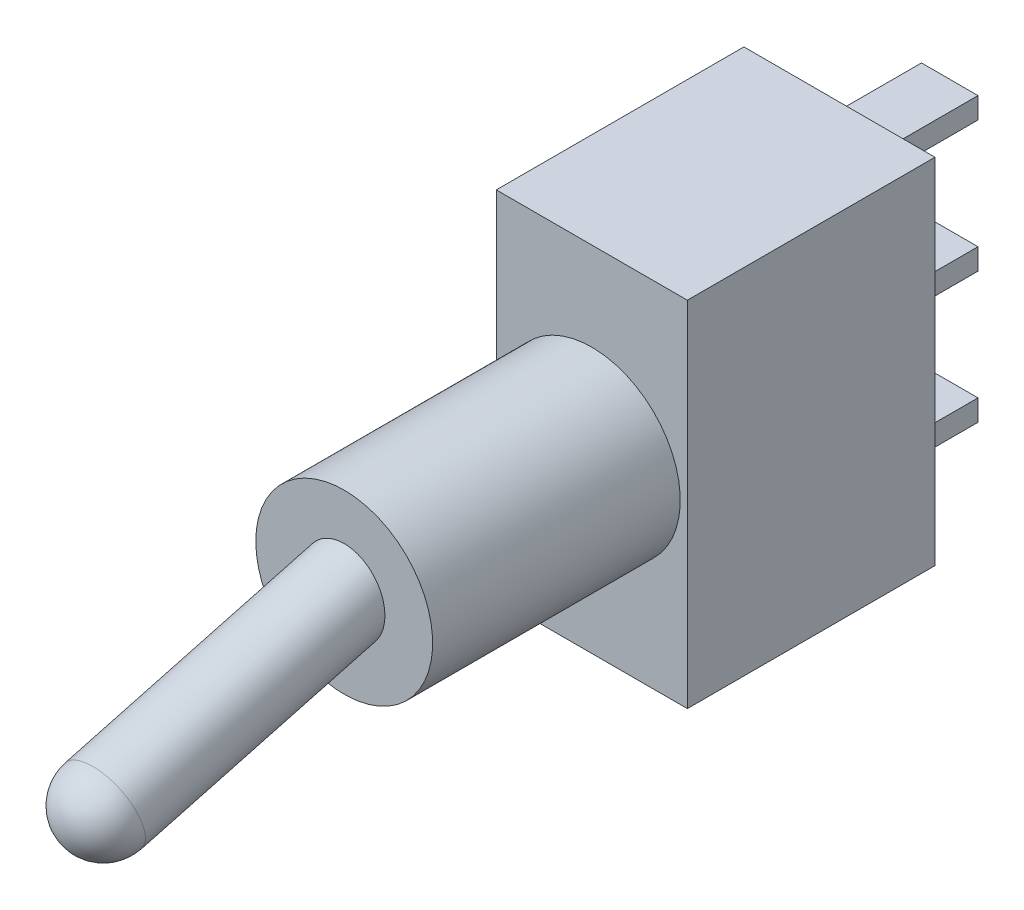
ISO-10303-21;
HEADER;
FILE_DESCRIPTION(('STEP AP214'),'2;1');
FILE_NAME('part.step','',(''),(''),'','','');
FILE_SCHEMA(('AUTOMOTIVE_DESIGN { 1 0 10303 214 1 1 1 1 }'));
ENDSEC;
DATA;
#1=APPLICATION_CONTEXT('core data for automotive mechanical design processes');
#2=APPLICATION_PROTOCOL_DEFINITION('international standard','automotive_design',2000,#1);
#3=PRODUCT_CONTEXT('',#1,'mechanical');
#4=PRODUCT('Part','Part','',(#3));
#5=PRODUCT_RELATED_PRODUCT_CATEGORY('part','',(#4));
#6=PRODUCT_DEFINITION_FORMATION('','',#4);
#7=PRODUCT_DEFINITION_CONTEXT('part definition',#1,'design');
#8=PRODUCT_DEFINITION('design','',#6,#7);
#9=PRODUCT_DEFINITION_SHAPE('','',#8);
#10=(LENGTH_UNIT() NAMED_UNIT(*) SI_UNIT(.MILLI.,.METRE.));
#11=(NAMED_UNIT(*) PLANE_ANGLE_UNIT() SI_UNIT($,.RADIAN.));
#12=(NAMED_UNIT(*) SI_UNIT($,.STERADIAN.) SOLID_ANGLE_UNIT());
#13=UNCERTAINTY_MEASURE_WITH_UNIT(LENGTH_MEASURE(1.E-05),#10,'distance_accuracy_value','');
#14=(GEOMETRIC_REPRESENTATION_CONTEXT(3) GLOBAL_UNCERTAINTY_ASSIGNED_CONTEXT((#13)) GLOBAL_UNIT_ASSIGNED_CONTEXT((#10,
#11,#12)) REPRESENTATION_CONTEXT('',''));
#15=CARTESIAN_POINT('',(0.,0.,0.));
#16=DIRECTION('',(0.,0.,1.));
#17=DIRECTION('',(1.,0.,0.));
#18=AXIS2_PLACEMENT_3D('',#15,#16,#17);
#19=CARTESIAN_POINT('',(0.,0.,-8.89));
#20=DIRECTION('',(0.,0.,1.));
#21=DIRECTION('',(1.,0.,0.));
#22=AXIS2_PLACEMENT_3D('',#19,#20,#21);
#23=PLANE('',#22);
#24=DIRECTION('',(0.,1.,0.));
#25=VECTOR('',#24,1.);
#26=CARTESIAN_POINT('',(-1.015,5.08,-8.89));
#27=LINE('',#26,#25);
#28=CARTESIAN_POINT('',(-1.015,4.32,-8.89));
#29=VERTEX_POINT('',#28);
#30=CARTESIAN_POINT('',(-1.015,5.08,-8.89));
#31=VERTEX_POINT('',#30);
#32=EDGE_CURVE('E169',#29,#31,#27,.T.);
#33=ORIENTED_EDGE('',*,*,#32,.F.);
#34=DIRECTION('',(-1.,0.,0.));
#35=VECTOR('',#34,1.);
#36=CARTESIAN_POINT('',(1.015,4.32,-8.89));
#37=LINE('',#36,#35);
#38=CARTESIAN_POINT('',(1.015,4.32,-8.89));
#39=VERTEX_POINT('',#38);
#40=EDGE_CURVE('E182',#39,#29,#37,.T.);
#41=ORIENTED_EDGE('',*,*,#40,.F.);
#42=DIRECTION('',(0.,-1.,0.));
#43=VECTOR('',#42,1.);
#44=CARTESIAN_POINT('',(1.015,5.08,-8.89));
#45=LINE('',#44,#43);
#46=CARTESIAN_POINT('',(1.015,5.08,-8.89));
#47=VERTEX_POINT('',#46);
#48=EDGE_CURVE('E191',#47,#39,#45,.T.);
#49=ORIENTED_EDGE('',*,*,#48,.F.);
#50=DIRECTION('',(1.,0.,0.));
#51=VECTOR('',#50,1.);
#52=CARTESIAN_POINT('',(1.015,5.08,-8.89));
#53=LINE('',#52,#51);
#54=EDGE_CURVE('E172',#31,#47,#53,.T.);
#55=ORIENTED_EDGE('',*,*,#54,.F.);
#56=EDGE_LOOP('',(#33,#41,#49,#55));
#57=FACE_BOUND('',#56,.T.);
#58=DIRECTION('',(0.,1.,0.));
#59=VECTOR('',#58,1.);
#60=CARTESIAN_POINT('',(3.43,6.35,-8.89));
#61=LINE('',#60,#59);
#62=CARTESIAN_POINT('',(3.43,-6.35,-8.89));
#63=VERTEX_POINT('',#62);
#64=CARTESIAN_POINT('',(3.43,6.35,-8.89));
#65=VERTEX_POINT('',#64);
#66=EDGE_CURVE('E250',#63,#65,#61,.T.);
#67=ORIENTED_EDGE('',*,*,#66,.F.);
#68=DIRECTION('',(1.,0.,0.));
#69=VECTOR('',#68,1.);
#70=CARTESIAN_POINT('',(-3.43,-6.35,-8.89));
#71=LINE('',#70,#69);
#72=CARTESIAN_POINT('',(-3.43,-6.35,-8.89));
#73=VERTEX_POINT('',#72);
#74=EDGE_CURVE('E260',#73,#63,#71,.T.);
#75=ORIENTED_EDGE('',*,*,#74,.F.);
#76=DIRECTION('',(0.,-1.,0.));
#77=VECTOR('',#76,1.);
#78=CARTESIAN_POINT('',(-3.43,6.35,-8.89));
#79=LINE('',#78,#77);
#80=CARTESIAN_POINT('',(-3.43,6.35,-8.89));
#81=VERTEX_POINT('',#80);
#82=EDGE_CURVE('E257',#81,#73,#79,.T.);
#83=ORIENTED_EDGE('',*,*,#82,.F.);
#84=DIRECTION('',(-1.,0.,0.));
#85=VECTOR('',#84,1.);
#86=CARTESIAN_POINT('',(-3.43,6.35,-8.89));
#87=LINE('',#86,#85);
#88=EDGE_CURVE('E253',#65,#81,#87,.T.);
#89=ORIENTED_EDGE('',*,*,#88,.F.);
#90=EDGE_LOOP('',(#67,#75,#83,#89));
#91=FACE_BOUND('',#90,.T.);
#92=DIRECTION('',(0.,1.,0.));
#93=VECTOR('',#92,1.);
#94=CARTESIAN_POINT('',(-1.015,0.38,-8.89));
#95=LINE('',#94,#93);
#96=CARTESIAN_POINT('',(-1.015,-0.38,-8.89));
#97=VERTEX_POINT('',#96);
#98=CARTESIAN_POINT('',(-1.015,0.38,-8.89));
#99=VERTEX_POINT('',#98);
#100=EDGE_CURVE('E207',#97,#99,#95,.T.);
#101=ORIENTED_EDGE('',*,*,#100,.F.);
#102=DIRECTION('',(-1.,0.,0.));
#103=VECTOR('',#102,1.);
#104=CARTESIAN_POINT('',(1.015,-0.38,-8.89));
#105=LINE('',#104,#103);
#106=CARTESIAN_POINT('',(1.015,-0.38,-8.89));
#107=VERTEX_POINT('',#106);
#108=EDGE_CURVE('E212',#107,#97,#105,.T.);
#109=ORIENTED_EDGE('',*,*,#108,.F.);
#110=DIRECTION('',(0.,-1.,0.));
#111=VECTOR('',#110,1.);
#112=CARTESIAN_POINT('',(1.015,0.38,-8.89));
#113=LINE('',#112,#111);
#114=CARTESIAN_POINT('',(1.015,0.38,-8.89));
#115=VERTEX_POINT('',#114);
#116=EDGE_CURVE('E224',#115,#107,#113,.T.);
#117=ORIENTED_EDGE('',*,*,#116,.F.);
#118=DIRECTION('',(1.,0.,0.));
#119=VECTOR('',#118,1.);
#120=CARTESIAN_POINT('',(1.015,0.38,-8.89));
#121=LINE('',#120,#119);
#122=EDGE_CURVE('E221',#99,#115,#121,.T.);
#123=ORIENTED_EDGE('',*,*,#122,.F.);
#124=EDGE_LOOP('',(#101,#109,#117,#123));
#125=FACE_BOUND('',#124,.T.);
#126=DIRECTION('',(0.,1.,0.));
#127=VECTOR('',#126,1.);
#128=CARTESIAN_POINT('',(-1.015,-4.32,-8.89));
#129=LINE('',#128,#127);
#130=CARTESIAN_POINT('',(-1.015,-5.08,-8.89));
#131=VERTEX_POINT('',#130);
#132=CARTESIAN_POINT('',(-1.015,-4.32,-8.89));
#133=VERTEX_POINT('',#132);
#134=EDGE_CURVE('E168',#131,#133,#129,.T.);
#135=ORIENTED_EDGE('',*,*,#134,.F.);
#136=DIRECTION('',(-1.,0.,0.));
#137=VECTOR('',#136,1.);
#138=CARTESIAN_POINT('',(1.015,-5.08,-8.89));
#139=LINE('',#138,#137);
#140=CARTESIAN_POINT('',(1.015,-5.08,-8.89));
#141=VERTEX_POINT('',#140);
#142=EDGE_CURVE('E165',#141,#131,#139,.T.);
#143=ORIENTED_EDGE('',*,*,#142,.F.);
#144=DIRECTION('',(0.,-1.,0.));
#145=VECTOR('',#144,1.);
#146=CARTESIAN_POINT('',(1.015,-4.32,-8.89));
#147=LINE('',#146,#145);
#148=CARTESIAN_POINT('',(1.015,-4.32,-8.89));
#149=VERTEX_POINT('',#148);
#150=EDGE_CURVE('E55',#149,#141,#147,.T.);
#151=ORIENTED_EDGE('',*,*,#150,.F.);
#152=DIRECTION('',(1.,0.,0.));
#153=VECTOR('',#152,1.);
#154=CARTESIAN_POINT('',(1.015,-4.32,-8.89));
#155=LINE('',#154,#153);
#156=EDGE_CURVE('E50',#133,#149,#155,.T.);
#157=ORIENTED_EDGE('',*,*,#156,.F.);
#158=EDGE_LOOP('',(#135,#143,#151,#157));
#159=FACE_BOUND('',#158,.T.);
#160=ADVANCED_FACE('F35',(#57,#91,#125,#159),#23,.F.);
#161=CARTESIAN_POINT('',(3.43,6.35,-8.89));
#162=DIRECTION('',(1.,0.,0.));
#163=DIRECTION('',(0.,1.,0.));
#164=AXIS2_PLACEMENT_3D('',#161,#162,#163);
#165=PLANE('',#164);
#166=DIRECTION('',(0.,1.,0.));
#167=VECTOR('',#166,1.);
#168=CARTESIAN_POINT('',(3.43,6.35,0.));
#169=LINE('',#168,#167);
#170=CARTESIAN_POINT('',(3.43,-6.35,0.));
#171=VERTEX_POINT('',#170);
#172=CARTESIAN_POINT('',(3.43,6.35,0.));
#173=VERTEX_POINT('',#172);
#174=EDGE_CURVE('E247',#171,#173,#169,.T.);
#175=ORIENTED_EDGE('',*,*,#174,.F.);
#176=DIRECTION('',(0.,0.,1.));
#177=VECTOR('',#176,1.);
#178=CARTESIAN_POINT('',(3.43,-6.35,-8.89));
#179=LINE('',#178,#177);
#180=EDGE_CURVE('E43',#63,#171,#179,.T.);
#181=ORIENTED_EDGE('',*,*,#180,.F.);
#182=ORIENTED_EDGE('',*,*,#66,.T.);
#183=DIRECTION('',(0.,0.,1.));
#184=VECTOR('',#183,1.);
#185=CARTESIAN_POINT('',(3.43,6.35,-8.89));
#186=LINE('',#185,#184);
#187=EDGE_CURVE('E263',#65,#173,#186,.T.);
#188=ORIENTED_EDGE('',*,*,#187,.T.);
#189=EDGE_LOOP('',(#175,#181,#182,#188));
#190=FACE_BOUND('',#189,.T.);
#191=ADVANCED_FACE('F37',(#190),#165,.T.);
#192=CARTESIAN_POINT('',(-3.43,-6.35,-8.89));
#193=DIRECTION('',(0.,-1.,0.));
#194=DIRECTION('',(1.,0.,0.));
#195=AXIS2_PLACEMENT_3D('',#192,#193,#194);
#196=PLANE('',#195);
#197=DIRECTION('',(1.,0.,0.));
#198=VECTOR('',#197,1.);
#199=CARTESIAN_POINT('',(-3.43,-6.35,0.));
#200=LINE('',#199,#198);
#201=CARTESIAN_POINT('',(-3.43,-6.35,0.));
#202=VERTEX_POINT('',#201);
#203=EDGE_CURVE('E254',#202,#171,#200,.T.);
#204=ORIENTED_EDGE('',*,*,#203,.F.);
#205=DIRECTION('',(0.,0.,1.));
#206=VECTOR('',#205,1.);
#207=CARTESIAN_POINT('',(-3.43,-6.35,-8.89));
#208=LINE('',#207,#206);
#209=EDGE_CURVE('E275',#73,#202,#208,.T.);
#210=ORIENTED_EDGE('',*,*,#209,.F.);
#211=ORIENTED_EDGE('',*,*,#74,.T.);
#212=ORIENTED_EDGE('',*,*,#180,.T.);
#213=EDGE_LOOP('',(#204,#210,#211,#212));
#214=FACE_BOUND('',#213,.T.);
#215=ADVANCED_FACE('F290',(#214),#196,.T.);
#216=CARTESIAN_POINT('',(-3.43,6.35,-8.89));
#217=DIRECTION('',(-1.,0.,0.));
#218=DIRECTION('',(0.,-1.,0.));
#219=AXIS2_PLACEMENT_3D('',#216,#217,#218);
#220=PLANE('',#219);
#221=DIRECTION('',(0.,-1.,0.));
#222=VECTOR('',#221,1.);
#223=CARTESIAN_POINT('',(-3.43,6.35,0.));
#224=LINE('',#223,#222);
#225=CARTESIAN_POINT('',(-3.43,6.35,0.));
#226=VERTEX_POINT('',#225);
#227=EDGE_CURVE('E269',#226,#202,#224,.T.);
#228=ORIENTED_EDGE('',*,*,#227,.F.);
#229=DIRECTION('',(0.,0.,1.));
#230=VECTOR('',#229,1.);
#231=CARTESIAN_POINT('',(-3.43,6.35,-8.89));
#232=LINE('',#231,#230);
#233=EDGE_CURVE('E277',#81,#226,#232,.T.);
#234=ORIENTED_EDGE('',*,*,#233,.F.);
#235=ORIENTED_EDGE('',*,*,#82,.T.);
#236=ORIENTED_EDGE('',*,*,#209,.T.);
#237=EDGE_LOOP('',(#228,#234,#235,#236));
#238=FACE_BOUND('',#237,.T.);
#239=ADVANCED_FACE('F296',(#238),#220,.T.);
#240=CARTESIAN_POINT('',(-3.43,6.35,-8.89));
#241=DIRECTION('',(0.,1.,0.));
#242=DIRECTION('',(-1.,0.,0.));
#243=AXIS2_PLACEMENT_3D('',#240,#241,#242);
#244=PLANE('',#243);
#245=DIRECTION('',(-1.,0.,0.));
#246=VECTOR('',#245,1.);
#247=CARTESIAN_POINT('',(-3.43,6.35,0.));
#248=LINE('',#247,#246);
#249=EDGE_CURVE('E266',#173,#226,#248,.T.);
#250=ORIENTED_EDGE('',*,*,#249,.F.);
#251=ORIENTED_EDGE('',*,*,#187,.F.);
#252=ORIENTED_EDGE('',*,*,#88,.T.);
#253=ORIENTED_EDGE('',*,*,#233,.T.);
#254=EDGE_LOOP('',(#250,#251,#252,#253));
#255=FACE_BOUND('',#254,.T.);
#256=ADVANCED_FACE('F284',(#255),#244,.T.);
#257=CARTESIAN_POINT('',(0.,0.,0.));
#258=DIRECTION('',(0.,0.,1.));
#259=DIRECTION('',(1.,0.,0.));
#260=AXIS2_PLACEMENT_3D('',#257,#258,#259);
#261=PLANE('',#260);
#262=CARTESIAN_POINT('',(0.,0.,0.));
#263=DIRECTION('',(0.,0.,1.));
#264=DIRECTION('',(1.,0.,0.));
#265=AXIS2_PLACEMENT_3D('',#262,#263,#264);
#266=CIRCLE('',#265,3.175);
#267=CARTESIAN_POINT('',(-3.175,0.,0.));
#268=VERTEX_POINT('',#267);
#269=EDGE_CURVE('E243',#268,#268,#266,.T.);
#270=ORIENTED_EDGE('',*,*,#269,.F.);
#271=EDGE_LOOP('',(#270));
#272=FACE_BOUND('',#271,.T.);
#273=ORIENTED_EDGE('',*,*,#174,.T.);
#274=ORIENTED_EDGE('',*,*,#249,.T.);
#275=ORIENTED_EDGE('',*,*,#227,.T.);
#276=ORIENTED_EDGE('',*,*,#203,.T.);
#277=EDGE_LOOP('',(#273,#274,#275,#276));
#278=FACE_BOUND('',#277,.T.);
#279=ADVANCED_FACE('F287',(#272,#278),#261,.T.);
#280=CARTESIAN_POINT('',(0.,0.,8.89));
#281=DIRECTION('',(0.,0.,-1.));
#282=DIRECTION('',(-1.,0.,0.));
#283=AXIS2_PLACEMENT_3D('',#280,#281,#282);
#284=CYLINDRICAL_SURFACE('',#283,3.175);
#285=CARTESIAN_POINT('',(0.,0.,8.89));
#286=DIRECTION('',(0.,0.,1.));
#287=DIRECTION('',(1.,0.,0.));
#288=AXIS2_PLACEMENT_3D('',#285,#286,#287);
#289=CIRCLE('',#288,3.175);
#290=CARTESIAN_POINT('',(-3.175,0.,8.89));
#291=VERTEX_POINT('',#290);
#292=EDGE_CURVE('E244',#291,#291,#289,.T.);
#293=CARTESIAN_POINT('',(-3.175,0.,8.89));
#294=CARTESIAN_POINT('',(-3.175,0.,8.79739583333333));
#295=CARTESIAN_POINT('',(-3.175,0.,8.70479166666667));
#296=CARTESIAN_POINT('',(-3.175,0.,8.51958333333333));
#297=CARTESIAN_POINT('',(-3.175,0.,8.42697916666667));
#298=CARTESIAN_POINT('',(-3.175,0.,8.24177083333333));
#299=CARTESIAN_POINT('',(-3.175,0.,8.14916666666667));
#300=CARTESIAN_POINT('',(-3.175,0.,7.96395833333333));
#301=CARTESIAN_POINT('',(-3.175,0.,7.87135416666667));
#302=CARTESIAN_POINT('',(-3.175,0.,7.68614583333333));
#303=CARTESIAN_POINT('',(-3.175,0.,7.59354166666667));
#304=CARTESIAN_POINT('',(-3.175,0.,7.40833333333333));
#305=CARTESIAN_POINT('',(-3.175,0.,7.31572916666667));
#306=CARTESIAN_POINT('',(-3.175,0.,7.13052083333333));
#307=CARTESIAN_POINT('',(-3.175,0.,7.03791666666667));
#308=CARTESIAN_POINT('',(-3.175,0.,6.85270833333333));
#309=CARTESIAN_POINT('',(-3.175,0.,6.76010416666667));
#310=CARTESIAN_POINT('',(-3.175,0.,6.57489583333333));
#311=CARTESIAN_POINT('',(-3.175,0.,6.48229166666667));
#312=CARTESIAN_POINT('',(-3.175,0.,6.29708333333333));
#313=CARTESIAN_POINT('',(-3.175,0.,6.20447916666667));
#314=CARTESIAN_POINT('',(-3.175,0.,6.01927083333333));
#315=CARTESIAN_POINT('',(-3.175,0.,5.92666666666667));
#316=CARTESIAN_POINT('',(-3.175,0.,5.74145833333333));
#317=CARTESIAN_POINT('',(-3.175,0.,5.64885416666667));
#318=CARTESIAN_POINT('',(-3.175,0.,5.46364583333333));
#319=CARTESIAN_POINT('',(-3.175,0.,5.37104166666667));
#320=CARTESIAN_POINT('',(-3.175,0.,5.18583333333333));
#321=CARTESIAN_POINT('',(-3.175,0.,5.09322916666667));
#322=CARTESIAN_POINT('',(-3.175,0.,4.90802083333333));
#323=CARTESIAN_POINT('',(-3.175,0.,4.81541666666667));
#324=CARTESIAN_POINT('',(-3.175,0.,4.63020833333333));
#325=CARTESIAN_POINT('',(-3.175,0.,4.53760416666667));
#326=CARTESIAN_POINT('',(-3.175,0.,4.35239583333333));
#327=CARTESIAN_POINT('',(-3.175,0.,4.25979166666667));
#328=CARTESIAN_POINT('',(-3.175,0.,4.07458333333333));
#329=CARTESIAN_POINT('',(-3.175,0.,3.98197916666667));
#330=CARTESIAN_POINT('',(-3.175,0.,3.79677083333333));
#331=CARTESIAN_POINT('',(-3.175,0.,3.70416666666667));
#332=CARTESIAN_POINT('',(-3.175,0.,3.51895833333333));
#333=CARTESIAN_POINT('',(-3.175,0.,3.42635416666667));
#334=CARTESIAN_POINT('',(-3.175,0.,3.24114583333333));
#335=CARTESIAN_POINT('',(-3.175,0.,3.14854166666667));
#336=CARTESIAN_POINT('',(-3.175,0.,2.96333333333333));
#337=CARTESIAN_POINT('',(-3.175,0.,2.87072916666667));
#338=CARTESIAN_POINT('',(-3.175,0.,2.68552083333333));
#339=CARTESIAN_POINT('',(-3.175,0.,2.59291666666667));
#340=CARTESIAN_POINT('',(-3.175,0.,2.40770833333333));
#341=CARTESIAN_POINT('',(-3.175,0.,2.31510416666667));
#342=CARTESIAN_POINT('',(-3.175,0.,2.12989583333333));
#343=CARTESIAN_POINT('',(-3.175,0.,2.03729166666667));
#344=CARTESIAN_POINT('',(-3.175,0.,1.85208333333333));
#345=CARTESIAN_POINT('',(-3.175,0.,1.75947916666667));
#346=CARTESIAN_POINT('',(-3.175,0.,1.57427083333333));
#347=CARTESIAN_POINT('',(-3.175,0.,1.48166666666667));
#348=CARTESIAN_POINT('',(-3.175,0.,1.29645833333333));
#349=CARTESIAN_POINT('',(-3.175,0.,1.20385416666667));
#350=CARTESIAN_POINT('',(-3.175,0.,1.01864583333333));
#351=CARTESIAN_POINT('',(-3.175,0.,0.926041666666667));
#352=CARTESIAN_POINT('',(-3.175,0.,0.740833333333334));
#353=CARTESIAN_POINT('',(-3.175,0.,0.648229166666667));
#354=CARTESIAN_POINT('',(-3.175,0.,0.463020833333334));
#355=CARTESIAN_POINT('',(-3.175,0.,0.370416666666667));
#356=CARTESIAN_POINT('',(-3.175,0.,0.185208333333334));
#357=CARTESIAN_POINT('',(-3.175,0.,0.0926041666666669));
#358=CARTESIAN_POINT('',(-3.175,0.,0.));
#359=B_SPLINE_CURVE_WITH_KNOTS('',3,(#293,#294,#295,#296,#297,#298,#299,#300,#301,#302,#303,
#304,#305,#306,#307,#308,#309,#310,#311,#312,#313,#314,#315,#316,#317,#318,#319,#320,#321,#322,
#323,#324,#325,#326,#327,#328,#329,#330,#331,#332,#333,#334,#335,#336,#337,#338,#339,#340,#341,
#342,#343,#344,#345,#346,#347,#348,#349,#350,#351,#352,#353,#354,#355,#356,#357,#358),
.UNSPECIFIED.,.F.,.F.,(4,2,2,2,2,2,2,2,2,2,2,2,2,2,2,2,2,2,2,2,2,2,2,2,2,2,2,2,2,2,2,2,4),(0.,
0.2778125,0.555625000000001,0.833437500000001,1.11125,1.3890625,1.666875,1.9446875,2.2225,
2.5003125,2.778125,3.0559375,3.33375,3.6115625,3.889375,4.1671875,4.445,4.7228125,5.000625,
5.2784375,5.55625,5.8340625,6.111875,6.3896875,6.6675,6.9453125,7.223125,7.5009375,7.77875,
8.0565625,8.334375,8.6121875,8.89),.UNSPECIFIED.);
#360=EDGE_CURVE('BSEAM312',#291,#268,#359,.T.);
#361=ORIENTED_EDGE('',*,*,#292,.F.);
#362=ORIENTED_EDGE('',*,*,#269,.T.);
#363=ORIENTED_EDGE('',*,*,#360,.T.);
#364=ORIENTED_EDGE('',*,*,#360,.F.);
#365=EDGE_LOOP('',(#361,#363,#362,#364));
#366=FACE_BOUND('',#365,.T.);
#367=ADVANCED_FACE('F312',(#366),#284,.T.);
#368=CARTESIAN_POINT('',(0.,0.,8.89));
#369=DIRECTION('',(0.,0.,1.));
#370=DIRECTION('',(1.,0.,0.));
#371=AXIS2_PLACEMENT_3D('',#368,#369,#370);
#372=PLANE('',#371);
#373=CARTESIAN_POINT('',(0.,0.,8.89));
#374=DIRECTION('',(0.,0.,1.));
#375=DIRECTION('',(0.,1.,0.));
#376=AXIS2_PLACEMENT_3D('',#373,#374,#375);
#377=ELLIPSE('',#376,1.51150322339872,1.46);
#378=CARTESIAN_POINT('',(0.,1.51150322339872,8.89));
#379=VERTEX_POINT('',#378);
#380=EDGE_CURVE('E11',#379,#379,#377,.T.);
#381=ORIENTED_EDGE('',*,*,#380,.F.);
#382=EDGE_LOOP('',(#381));
#383=FACE_BOUND('',#382,.T.);
#384=ORIENTED_EDGE('',*,*,#292,.T.);
#385=EDGE_LOOP('',(#384));
#386=FACE_BOUND('',#385,.T.);
#387=ADVANCED_FACE('F319',(#383,#386),#372,.T.);
#388=CARTESIAN_POINT('',(0.,-2.31643045366758,17.5350361452872));
#389=DIRECTION('',(0.,0.258819045102522,-0.965925826289068));
#390=DIRECTION('',(0.,0.965925826289068,0.258819045102522));
#391=AXIS2_PLACEMENT_3D('',#388,#389,#390);
#392=SPHERICAL_SURFACE('',#391,1.45999999999998);
#393=CARTESIAN_POINT('',(0.,-2.31643045366758,17.5350361452872));
#394=DIRECTION('',(0.,0.258819045102522,-0.965925826289068));
#395=DIRECTION('',(0.,0.965925826289068,0.258819045102522));
#396=AXIS2_PLACEMENT_3D('',#393,#394,#395);
#397=CIRCLE('',#396,1.46);
#398=CARTESIAN_POINT('',(0.,-0.90617874728554,17.9129119511369));
#399=VERTEX_POINT('',#398);
#400=EDGE_CURVE('E240',#399,#399,#397,.T.);
#401=ORIENTED_EDGE('',*,*,#400,.F.);
#402=EDGE_LOOP('',(#401));
#403=FACE_BOUND('',#402,.T.);
#404=ADVANCED_FACE('F326',(#403),#392,.T.);
#405=CARTESIAN_POINT('',(0.,0.,8.89));
#406=DIRECTION('',(0.,0.258819045102522,-0.965925826289068));
#407=DIRECTION('',(0.,0.965925826289068,0.258819045102522));
#408=AXIS2_PLACEMENT_3D('',#405,#406,#407);
#409=CYLINDRICAL_SURFACE('',#408,1.46);
#410=ORIENTED_EDGE('',*,*,#380,.T.);
#411=EDGE_LOOP('',(#410));
#412=FACE_BOUND('',#411,.T.);
#413=ORIENTED_EDGE('',*,*,#400,.T.);
#414=EDGE_LOOP('',(#413));
#415=FACE_BOUND('',#414,.T.);
#416=ADVANCED_FACE('F333',(#412,#415),#409,.T.);
#417=CARTESIAN_POINT('',(-1.015,0.38,-12.85));
#418=DIRECTION('',(1.,0.,0.));
#419=DIRECTION('',(0.,0.,-1.));
#420=AXIS2_PLACEMENT_3D('',#417,#418,#419);
#421=PLANE('',#420);
#422=ORIENTED_EDGE('',*,*,#100,.T.);
#423=DIRECTION('',(0.,0.,1.));
#424=VECTOR('',#423,1.);
#425=CARTESIAN_POINT('',(-1.015,0.38,-12.85));
#426=LINE('',#425,#424);
#427=CARTESIAN_POINT('',(-1.015,0.38,-12.85));
#428=VERTEX_POINT('',#427);
#429=EDGE_CURVE('E237',#428,#99,#426,.T.);
#430=ORIENTED_EDGE('',*,*,#429,.F.);
#431=DIRECTION('',(0.,1.,0.));
#432=VECTOR('',#431,1.);
#433=CARTESIAN_POINT('',(-1.015,0.38,-12.85));
#434=LINE('',#433,#432);
#435=CARTESIAN_POINT('',(-1.015,-0.38,-12.85));
#436=VERTEX_POINT('',#435);
#437=EDGE_CURVE('E208',#436,#428,#434,.T.);
#438=ORIENTED_EDGE('',*,*,#437,.F.);
#439=DIRECTION('',(0.,0.,1.));
#440=VECTOR('',#439,1.);
#441=CARTESIAN_POINT('',(-1.015,-0.38,-12.85));
#442=LINE('',#441,#440);
#443=EDGE_CURVE('E218',#436,#97,#442,.T.);
#444=ORIENTED_EDGE('',*,*,#443,.T.);
#445=EDGE_LOOP('',(#422,#430,#438,#444));
#446=FACE_BOUND('',#445,.T.);
#447=ADVANCED_FACE('F340',(#446),#421,.F.);
#448=CARTESIAN_POINT('',(1.015,0.38,-12.85));
#449=DIRECTION('',(0.,-1.,0.));
#450=DIRECTION('',(0.,0.,-1.));
#451=AXIS2_PLACEMENT_3D('',#448,#449,#450);
#452=PLANE('',#451);
#453=ORIENTED_EDGE('',*,*,#122,.T.);
#454=DIRECTION('',(0.,0.,1.));
#455=VECTOR('',#454,1.);
#456=CARTESIAN_POINT('',(1.015,0.38,-12.85));
#457=LINE('',#456,#455);
#458=CARTESIAN_POINT('',(1.015,0.38,-12.85));
#459=VERTEX_POINT('',#458);
#460=EDGE_CURVE('E234',#459,#115,#457,.T.);
#461=ORIENTED_EDGE('',*,*,#460,.F.);
#462=DIRECTION('',(1.,0.,0.));
#463=VECTOR('',#462,1.);
#464=CARTESIAN_POINT('',(1.015,0.38,-12.85));
#465=LINE('',#464,#463);
#466=EDGE_CURVE('E211',#428,#459,#465,.T.);
#467=ORIENTED_EDGE('',*,*,#466,.F.);
#468=ORIENTED_EDGE('',*,*,#429,.T.);
#469=EDGE_LOOP('',(#453,#461,#467,#468));
#470=FACE_BOUND('',#469,.T.);
#471=ADVANCED_FACE('F344',(#470),#452,.F.);
#472=CARTESIAN_POINT('',(1.015,0.38,-12.85));
#473=DIRECTION('',(-1.,0.,0.));
#474=DIRECTION('',(0.,-1.,0.));
#475=AXIS2_PLACEMENT_3D('',#472,#473,#474);
#476=PLANE('',#475);
#477=ORIENTED_EDGE('',*,*,#116,.T.);
#478=DIRECTION('',(0.,0.,1.));
#479=VECTOR('',#478,1.);
#480=CARTESIAN_POINT('',(1.015,-0.38,-12.85));
#481=LINE('',#480,#479);
#482=CARTESIAN_POINT('',(1.015,-0.38,-12.85));
#483=VERTEX_POINT('',#482);
#484=EDGE_CURVE('E231',#483,#107,#481,.T.);
#485=ORIENTED_EDGE('',*,*,#484,.F.);
#486=DIRECTION('',(0.,-1.,0.));
#487=VECTOR('',#486,1.);
#488=CARTESIAN_POINT('',(1.015,0.38,-12.85));
#489=LINE('',#488,#487);
#490=EDGE_CURVE('E214',#459,#483,#489,.T.);
#491=ORIENTED_EDGE('',*,*,#490,.F.);
#492=ORIENTED_EDGE('',*,*,#460,.T.);
#493=EDGE_LOOP('',(#477,#485,#491,#492));
#494=FACE_BOUND('',#493,.T.);
#495=ADVANCED_FACE('F348',(#494),#476,.F.);
#496=CARTESIAN_POINT('',(1.015,-0.38,-12.85));
#497=DIRECTION('',(0.,1.,0.));
#498=DIRECTION('',(-1.,0.,0.));
#499=AXIS2_PLACEMENT_3D('',#496,#497,#498);
#500=PLANE('',#499);
#501=ORIENTED_EDGE('',*,*,#108,.T.);
#502=ORIENTED_EDGE('',*,*,#443,.F.);
#503=DIRECTION('',(-1.,0.,0.));
#504=VECTOR('',#503,1.);
#505=CARTESIAN_POINT('',(1.015,-0.38,-12.85));
#506=LINE('',#505,#504);
#507=EDGE_CURVE('E216',#483,#436,#506,.T.);
#508=ORIENTED_EDGE('',*,*,#507,.F.);
#509=ORIENTED_EDGE('',*,*,#484,.T.);
#510=EDGE_LOOP('',(#501,#502,#508,#509));
#511=FACE_BOUND('',#510,.T.);
#512=ADVANCED_FACE('F352',(#511),#500,.F.);
#513=CARTESIAN_POINT('',(0.,0.,-12.85));
#514=DIRECTION('',(0.,0.,-1.));
#515=DIRECTION('',(-1.,0.,0.));
#516=AXIS2_PLACEMENT_3D('',#513,#514,#515);
#517=PLANE('',#516);
#518=ORIENTED_EDGE('',*,*,#437,.T.);
#519=ORIENTED_EDGE('',*,*,#466,.T.);
#520=ORIENTED_EDGE('',*,*,#490,.T.);
#521=ORIENTED_EDGE('',*,*,#507,.T.);
#522=EDGE_LOOP('',(#518,#519,#520,#521));
#523=FACE_BOUND('',#522,.T.);
#524=ADVANCED_FACE('F356',(#523),#517,.T.);
#525=CARTESIAN_POINT('',(-1.015,5.08,-12.85));
#526=DIRECTION('',(1.,0.,0.));
#527=DIRECTION('',(0.,0.,-1.));
#528=AXIS2_PLACEMENT_3D('',#525,#526,#527);
#529=PLANE('',#528);
#530=ORIENTED_EDGE('',*,*,#32,.T.);
#531=DIRECTION('',(0.,0.,1.));
#532=VECTOR('',#531,1.);
#533=CARTESIAN_POINT('',(-1.015,5.08,-12.85));
#534=LINE('',#533,#532);
#535=CARTESIAN_POINT('',(-1.015,5.08,-12.85));
#536=VERTEX_POINT('',#535);
#537=EDGE_CURVE('E204',#536,#31,#534,.T.);
#538=ORIENTED_EDGE('',*,*,#537,.F.);
#539=DIRECTION('',(0.,1.,0.));
#540=VECTOR('',#539,1.);
#541=CARTESIAN_POINT('',(-1.015,5.08,-12.85));
#542=LINE('',#541,#540);
#543=CARTESIAN_POINT('',(-1.015,4.32,-12.85));
#544=VERTEX_POINT('',#543);
#545=EDGE_CURVE('E178',#544,#536,#542,.T.);
#546=ORIENTED_EDGE('',*,*,#545,.F.);
#547=DIRECTION('',(0.,0.,1.));
#548=VECTOR('',#547,1.);
#549=CARTESIAN_POINT('',(-1.015,4.32,-12.85));
#550=LINE('',#549,#548);
#551=EDGE_CURVE('E187',#544,#29,#550,.T.);
#552=ORIENTED_EDGE('',*,*,#551,.T.);
#553=EDGE_LOOP('',(#530,#538,#546,#552));
#554=FACE_BOUND('',#553,.T.);
#555=ADVANCED_FACE('F360',(#554),#529,.F.);
#556=CARTESIAN_POINT('',(1.015,5.08,-12.85));
#557=DIRECTION('',(0.,-1.,0.));
#558=DIRECTION('',(0.,0.,-1.));
#559=AXIS2_PLACEMENT_3D('',#556,#557,#558);
#560=PLANE('',#559);
#561=ORIENTED_EDGE('',*,*,#54,.T.);
#562=DIRECTION('',(0.,0.,1.));
#563=VECTOR('',#562,1.);
#564=CARTESIAN_POINT('',(1.015,5.08,-12.85));
#565=LINE('',#564,#563);
#566=CARTESIAN_POINT('',(1.015,5.08,-12.85));
#567=VERTEX_POINT('',#566);
#568=EDGE_CURVE('E201',#567,#47,#565,.T.);
#569=ORIENTED_EDGE('',*,*,#568,.F.);
#570=DIRECTION('',(1.,0.,0.));
#571=VECTOR('',#570,1.);
#572=CARTESIAN_POINT('',(1.015,5.08,-12.85));
#573=LINE('',#572,#571);
#574=EDGE_CURVE('E181',#536,#567,#573,.T.);
#575=ORIENTED_EDGE('',*,*,#574,.F.);
#576=ORIENTED_EDGE('',*,*,#537,.T.);
#577=EDGE_LOOP('',(#561,#569,#575,#576));
#578=FACE_BOUND('',#577,.T.);
#579=ADVANCED_FACE('F364',(#578),#560,.F.);
#580=CARTESIAN_POINT('',(1.015,5.08,-12.85));
#581=DIRECTION('',(-1.,0.,0.));
#582=DIRECTION('',(0.,0.,1.));
#583=AXIS2_PLACEMENT_3D('',#580,#581,#582);
#584=PLANE('',#583);
#585=ORIENTED_EDGE('',*,*,#48,.T.);
#586=DIRECTION('',(0.,0.,1.));
#587=VECTOR('',#586,1.);
#588=CARTESIAN_POINT('',(1.015,4.32,-12.85));
#589=LINE('',#588,#587);
#590=CARTESIAN_POINT('',(1.015,4.32,-12.85));
#591=VERTEX_POINT('',#590);
#592=EDGE_CURVE('E198',#591,#39,#589,.T.);
#593=ORIENTED_EDGE('',*,*,#592,.F.);
#594=DIRECTION('',(0.,-1.,0.));
#595=VECTOR('',#594,1.);
#596=CARTESIAN_POINT('',(1.015,5.08,-12.85));
#597=LINE('',#596,#595);
#598=EDGE_CURVE('E184',#567,#591,#597,.T.);
#599=ORIENTED_EDGE('',*,*,#598,.F.);
#600=ORIENTED_EDGE('',*,*,#568,.T.);
#601=EDGE_LOOP('',(#585,#593,#599,#600));
#602=FACE_BOUND('',#601,.T.);
#603=ADVANCED_FACE('F368',(#602),#584,.F.);
#604=CARTESIAN_POINT('',(1.015,4.32,-12.85));
#605=DIRECTION('',(0.,1.,0.));
#606=DIRECTION('',(0.,0.,1.));
#607=AXIS2_PLACEMENT_3D('',#604,#605,#606);
#608=PLANE('',#607);
#609=ORIENTED_EDGE('',*,*,#40,.T.);
#610=ORIENTED_EDGE('',*,*,#551,.F.);
#611=DIRECTION('',(-1.,0.,0.));
#612=VECTOR('',#611,1.);
#613=CARTESIAN_POINT('',(1.015,4.32,-12.85));
#614=LINE('',#613,#612);
#615=EDGE_CURVE('E186',#591,#544,#614,.T.);
#616=ORIENTED_EDGE('',*,*,#615,.F.);
#617=ORIENTED_EDGE('',*,*,#592,.T.);
#618=EDGE_LOOP('',(#609,#610,#616,#617));
#619=FACE_BOUND('',#618,.T.);
#620=ADVANCED_FACE('F372',(#619),#608,.F.);
#621=CARTESIAN_POINT('',(0.,0.,-12.85));
#622=DIRECTION('',(0.,0.,-1.));
#623=DIRECTION('',(-1.,0.,0.));
#624=AXIS2_PLACEMENT_3D('',#621,#622,#623);
#625=PLANE('',#624);
#626=ORIENTED_EDGE('',*,*,#545,.T.);
#627=ORIENTED_EDGE('',*,*,#574,.T.);
#628=ORIENTED_EDGE('',*,*,#598,.T.);
#629=ORIENTED_EDGE('',*,*,#615,.T.);
#630=EDGE_LOOP('',(#626,#627,#628,#629));
#631=FACE_BOUND('',#630,.T.);
#632=ADVANCED_FACE('F376',(#631),#625,.T.);
#633=CARTESIAN_POINT('',(-1.015,-4.32,-12.85));
#634=DIRECTION('',(1.,0.,0.));
#635=DIRECTION('',(0.,1.,0.));
#636=AXIS2_PLACEMENT_3D('',#633,#634,#635);
#637=PLANE('',#636);
#638=ORIENTED_EDGE('',*,*,#134,.T.);
#639=DIRECTION('',(0.,0.,1.));
#640=VECTOR('',#639,1.);
#641=CARTESIAN_POINT('',(-1.015,-4.32,-12.85));
#642=LINE('',#641,#640);
#643=CARTESIAN_POINT('',(-1.015,-4.32,-12.85));
#644=VERTEX_POINT('',#643);
#645=EDGE_CURVE('E149',#644,#133,#642,.T.);
#646=ORIENTED_EDGE('',*,*,#645,.F.);
#647=DIRECTION('',(0.,1.,0.));
#648=VECTOR('',#647,1.);
#649=CARTESIAN_POINT('',(-1.015,-4.32,-12.85));
#650=LINE('',#649,#648);
#651=CARTESIAN_POINT('',(-1.015,-5.08,-12.85));
#652=VERTEX_POINT('',#651);
#653=EDGE_CURVE('E156',#652,#644,#650,.T.);
#654=ORIENTED_EDGE('',*,*,#653,.F.);
#655=DIRECTION('',(0.,0.,1.));
#656=VECTOR('',#655,1.);
#657=CARTESIAN_POINT('',(-1.015,-5.08,-12.85));
#658=LINE('',#657,#656);
#659=EDGE_CURVE('E536',#652,#131,#658,.T.);
#660=ORIENTED_EDGE('',*,*,#659,.T.);
#661=EDGE_LOOP('',(#638,#646,#654,#660));
#662=FACE_BOUND('',#661,.T.);
#663=ADVANCED_FACE('F167',(#662),#637,.F.);
#664=CARTESIAN_POINT('',(1.015,-4.32,-12.85));
#665=DIRECTION('',(0.,-1.,0.));
#666=DIRECTION('',(0.,0.,-1.));
#667=AXIS2_PLACEMENT_3D('',#664,#665,#666);
#668=PLANE('',#667);
#669=ORIENTED_EDGE('',*,*,#156,.T.);
#670=DIRECTION('',(0.,0.,1.));
#671=VECTOR('',#670,1.);
#672=CARTESIAN_POINT('',(1.015,-4.32,-12.85));
#673=LINE('',#672,#671);
#674=CARTESIAN_POINT('',(1.015,-4.32,-12.85));
#675=VERTEX_POINT('',#674);
#676=EDGE_CURVE('E152',#675,#149,#673,.T.);
#677=ORIENTED_EDGE('',*,*,#676,.F.);
#678=DIRECTION('',(1.,0.,0.));
#679=VECTOR('',#678,1.);
#680=CARTESIAN_POINT('',(1.015,-4.32,-12.85));
#681=LINE('',#680,#679);
#682=EDGE_CURVE('E145',#644,#675,#681,.T.);
#683=ORIENTED_EDGE('',*,*,#682,.F.);
#684=ORIENTED_EDGE('',*,*,#645,.T.);
#685=EDGE_LOOP('',(#669,#677,#683,#684));
#686=FACE_BOUND('',#685,.T.);
#687=ADVANCED_FACE('F147',(#686),#668,.F.);
#688=CARTESIAN_POINT('',(1.015,-4.32,-12.85));
#689=DIRECTION('',(-1.,0.,0.));
#690=DIRECTION('',(0.,-1.,0.));
#691=AXIS2_PLACEMENT_3D('',#688,#689,#690);
#692=PLANE('',#691);
#693=ORIENTED_EDGE('',*,*,#150,.T.);
#694=DIRECTION('',(0.,0.,1.));
#695=VECTOR('',#694,1.);
#696=CARTESIAN_POINT('',(1.015,-5.08,-12.85));
#697=LINE('',#696,#695);
#698=CARTESIAN_POINT('',(1.015,-5.08,-12.85));
#699=VERTEX_POINT('',#698);
#700=EDGE_CURVE('E174',#699,#141,#697,.T.);
#701=ORIENTED_EDGE('',*,*,#700,.F.);
#702=DIRECTION('',(0.,-1.,0.));
#703=VECTOR('',#702,1.);
#704=CARTESIAN_POINT('',(1.015,-4.32,-12.85));
#705=LINE('',#704,#703);
#706=EDGE_CURVE('E155',#675,#699,#705,.T.);
#707=ORIENTED_EDGE('',*,*,#706,.F.);
#708=ORIENTED_EDGE('',*,*,#676,.T.);
#709=EDGE_LOOP('',(#693,#701,#707,#708));
#710=FACE_BOUND('',#709,.T.);
#711=ADVANCED_FACE('F385',(#710),#692,.F.);
#712=CARTESIAN_POINT('',(1.015,-5.08,-12.85));
#713=DIRECTION('',(0.,1.,0.));
#714=DIRECTION('',(0.,0.,1.));
#715=AXIS2_PLACEMENT_3D('',#712,#713,#714);
#716=PLANE('',#715);
#717=ORIENTED_EDGE('',*,*,#142,.T.);
#718=ORIENTED_EDGE('',*,*,#659,.F.);
#719=DIRECTION('',(-1.,0.,0.));
#720=VECTOR('',#719,1.);
#721=CARTESIAN_POINT('',(1.015,-5.08,-12.85));
#722=LINE('',#721,#720);
#723=EDGE_CURVE('E161',#699,#652,#722,.T.);
#724=ORIENTED_EDGE('',*,*,#723,.F.);
#725=ORIENTED_EDGE('',*,*,#700,.T.);
#726=EDGE_LOOP('',(#717,#718,#724,#725));
#727=FACE_BOUND('',#726,.T.);
#728=ADVANCED_FACE('F388',(#727),#716,.F.);
#729=CARTESIAN_POINT('',(0.,0.,-12.85));
#730=DIRECTION('',(0.,0.,-1.));
#731=DIRECTION('',(-1.,0.,0.));
#732=AXIS2_PLACEMENT_3D('',#729,#730,#731);
#733=PLANE('',#732);
#734=ORIENTED_EDGE('',*,*,#653,.T.);
#735=ORIENTED_EDGE('',*,*,#682,.T.);
#736=ORIENTED_EDGE('',*,*,#706,.T.);
#737=ORIENTED_EDGE('',*,*,#723,.T.);
#738=EDGE_LOOP('',(#734,#735,#736,#737));
#739=FACE_BOUND('',#738,.T.);
#740=ADVANCED_FACE('F159',(#739),#733,.T.);
#741=CLOSED_SHELL('',(#160,#191,#215,#239,#256,#279,#367,#387,#404,#416,#447,#471,#495,#512,
#524,#555,#579,#603,#620,#632,#663,#687,#711,#728,#740));
#742=MANIFOLD_SOLID_BREP('B2',#741);
#743=ADVANCED_BREP_SHAPE_REPRESENTATION('',(#18,#742),#14);
#744=SHAPE_DEFINITION_REPRESENTATION(#9,#743);
ENDSEC;
END-ISO-10303-21;
